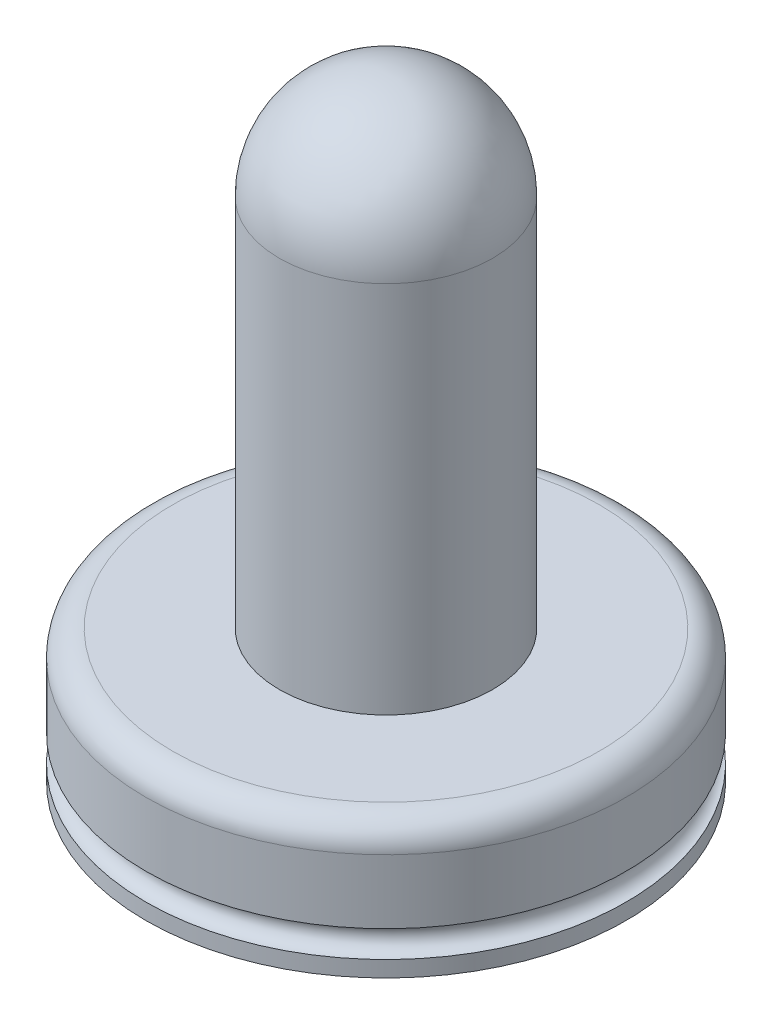
ISO-10303-21;
HEADER;
FILE_DESCRIPTION(('STEP AP214'),'2;1');
FILE_NAME('part.step','',(''),(''),'','','');
FILE_SCHEMA(('AUTOMOTIVE_DESIGN { 1 0 10303 214 1 1 1 1 }'));
ENDSEC;
DATA;
#1=APPLICATION_CONTEXT('core data for automotive mechanical design processes');
#2=APPLICATION_PROTOCOL_DEFINITION('international standard','automotive_design',2000,#1);
#3=PRODUCT_CONTEXT('',#1,'mechanical');
#4=PRODUCT('Part','Part','',(#3));
#5=PRODUCT_RELATED_PRODUCT_CATEGORY('part','',(#4));
#6=PRODUCT_DEFINITION_FORMATION('','',#4);
#7=PRODUCT_DEFINITION_CONTEXT('part definition',#1,'design');
#8=PRODUCT_DEFINITION('design','',#6,#7);
#9=PRODUCT_DEFINITION_SHAPE('','',#8);
#10=(LENGTH_UNIT() NAMED_UNIT(*) SI_UNIT(.MILLI.,.METRE.));
#11=(NAMED_UNIT(*) PLANE_ANGLE_UNIT() SI_UNIT($,.RADIAN.));
#12=(NAMED_UNIT(*) SI_UNIT($,.STERADIAN.) SOLID_ANGLE_UNIT());
#13=UNCERTAINTY_MEASURE_WITH_UNIT(LENGTH_MEASURE(1.E-05),#10,'distance_accuracy_value','');
#14=(GEOMETRIC_REPRESENTATION_CONTEXT(3) GLOBAL_UNCERTAINTY_ASSIGNED_CONTEXT((#13)) GLOBAL_UNIT_ASSIGNED_CONTEXT((#10,
#11,#12)) REPRESENTATION_CONTEXT('',''));
#15=CARTESIAN_POINT('',(0.,0.,0.));
#16=DIRECTION('',(0.,0.,1.));
#17=DIRECTION('',(1.,0.,0.));
#18=AXIS2_PLACEMENT_3D('',#15,#16,#17);
#19=CARTESIAN_POINT('',(0.,0.,0.));
#20=DIRECTION('',(0.,-1.,0.));
#21=DIRECTION('',(0.,0.,-1.));
#22=AXIS2_PLACEMENT_3D('',#19,#20,#21);
#23=CYLINDRICAL_SURFACE('',#22,8.50000000000001);
#24=CARTESIAN_POINT('',(0.,0.,0.));
#25=DIRECTION('',(0.,-1.,0.));
#26=DIRECTION('',(0.,0.,-1.));
#27=AXIS2_PLACEMENT_3D('',#24,#25,#26);
#28=CIRCLE('',#27,8.50000000000001);
#29=CARTESIAN_POINT('',(0.,0.,-8.50000000000001));
#30=VERTEX_POINT('',#29);
#31=EDGE_CURVE('E10',#30,#30,#28,.T.);
#32=ORIENTED_EDGE('',*,*,#31,.T.);
#33=EDGE_LOOP('',(#32));
#34=FACE_BOUND('',#33,.T.);
#35=CARTESIAN_POINT('',(0.,0.233974596215559,0.));
#36=DIRECTION('',(0.,-1.,0.));
#37=DIRECTION('',(0.,0.,-1.));
#38=AXIS2_PLACEMENT_3D('',#35,#36,#37);
#39=CIRCLE('',#38,8.5);
#40=CARTESIAN_POINT('',(0.,0.233974596215559,-8.5));
#41=VERTEX_POINT('',#40);
#42=EDGE_CURVE('E78',#41,#41,#39,.T.);
#43=ORIENTED_EDGE('',*,*,#42,.F.);
#44=EDGE_LOOP('',(#43));
#45=FACE_BOUND('',#44,.T.);
#46=ADVANCED_FACE('F32',(#34,#45),#23,.F.);
#47=CARTESIAN_POINT('',(9.00000000000001,0.,0.));
#48=DIRECTION('',(0.,1.,0.));
#49=DIRECTION('',(0.,0.,1.));
#50=AXIS2_PLACEMENT_3D('',#47,#48,#49);
#51=PLANE('',#50);
#52=ORIENTED_EDGE('',*,*,#31,.F.);
#53=EDGE_LOOP('',(#52));
#54=FACE_BOUND('',#53,.T.);
#55=CARTESIAN_POINT('',(0.,0.,0.));
#56=DIRECTION('',(0.,-1.,0.));
#57=DIRECTION('',(0.,0.,-1.));
#58=AXIS2_PLACEMENT_3D('',#55,#56,#57);
#59=CIRCLE('',#58,9.00000000000001);
#60=CARTESIAN_POINT('',(0.,0.,-9.00000000000001));
#61=VERTEX_POINT('',#60);
#62=EDGE_CURVE('E38',#61,#61,#59,.T.);
#63=ORIENTED_EDGE('',*,*,#62,.T.);
#64=EDGE_LOOP('',(#63));
#65=FACE_BOUND('',#64,.T.);
#66=ADVANCED_FACE('F86',(#54,#65),#51,.F.);
#67=CARTESIAN_POINT('',(0.,0.,0.));
#68=DIRECTION('',(0.,-1.,0.));
#69=DIRECTION('',(0.,0.,-1.));
#70=AXIS2_PLACEMENT_3D('',#67,#68,#69);
#71=CYLINDRICAL_SURFACE('',#70,9.00000000000001);
#72=ORIENTED_EDGE('',*,*,#62,.F.);
#73=EDGE_LOOP('',(#72));
#74=FACE_BOUND('',#73,.T.);
#75=CARTESIAN_POINT('',(0.,0.6,0.));
#76=DIRECTION('',(0.,-1.,0.));
#77=DIRECTION('',(0.,0.,-1.));
#78=AXIS2_PLACEMENT_3D('',#75,#76,#77);
#79=CIRCLE('',#78,9.);
#80=CARTESIAN_POINT('',(0.,0.6,-9.));
#81=VERTEX_POINT('',#80);
#82=EDGE_CURVE('E42',#81,#81,#79,.T.);
#83=ORIENTED_EDGE('',*,*,#82,.T.);
#84=EDGE_LOOP('',(#83));
#85=FACE_BOUND('',#84,.T.);
#86=ADVANCED_FACE('F90',(#74,#85),#71,.T.);
#87=CARTESIAN_POINT('',(0.,1.1,0.));
#88=DIRECTION('',(0.,-1.,0.));
#89=DIRECTION('',(0.,0.,-1.));
#90=AXIS2_PLACEMENT_3D('',#87,#88,#89);
#91=TOROIDAL_SURFACE('',#90,9.,0.5);
#92=ORIENTED_EDGE('',*,*,#82,.F.);
#93=EDGE_LOOP('',(#92));
#94=FACE_BOUND('',#93,.T.);
#95=CARTESIAN_POINT('',(0.,1.6,0.));
#96=DIRECTION('',(0.,-1.,0.));
#97=DIRECTION('',(0.,0.,-1.));
#98=AXIS2_PLACEMENT_3D('',#95,#96,#97);
#99=CIRCLE('',#98,9.);
#100=CARTESIAN_POINT('',(0.,1.6,-9.));
#101=VERTEX_POINT('',#100);
#102=EDGE_CURVE('E46',#101,#101,#99,.T.);
#103=ORIENTED_EDGE('',*,*,#102,.T.);
#104=EDGE_LOOP('',(#103));
#105=FACE_BOUND('',#104,.T.);
#106=ADVANCED_FACE('F95',(#94,#105),#91,.F.);
#107=CARTESIAN_POINT('',(0.,0.,0.));
#108=DIRECTION('',(0.,-1.,0.));
#109=DIRECTION('',(0.,0.,-1.));
#110=AXIS2_PLACEMENT_3D('',#107,#108,#109);
#111=CYLINDRICAL_SURFACE('',#110,9.);
#112=ORIENTED_EDGE('',*,*,#102,.F.);
#113=EDGE_LOOP('',(#112));
#114=FACE_BOUND('',#113,.T.);
#115=CARTESIAN_POINT('',(0.,4.,0.));
#116=DIRECTION('',(0.,-1.,0.));
#117=DIRECTION('',(0.,0.,-1.));
#118=AXIS2_PLACEMENT_3D('',#115,#116,#117);
#119=CIRCLE('',#118,9.);
#120=CARTESIAN_POINT('',(0.,4.,-9.));
#121=VERTEX_POINT('',#120);
#122=EDGE_CURVE('E51',#121,#121,#119,.T.);
#123=ORIENTED_EDGE('',*,*,#122,.T.);
#124=EDGE_LOOP('',(#123));
#125=FACE_BOUND('',#124,.T.);
#126=ADVANCED_FACE('F101',(#114,#125),#111,.T.);
#127=CARTESIAN_POINT('',(0.,4.,0.));
#128=DIRECTION('',(0.,-1.,0.));
#129=DIRECTION('',(0.,0.,-1.));
#130=AXIS2_PLACEMENT_3D('',#127,#128,#129);
#131=TOROIDAL_SURFACE('',#130,8.,1.);
#132=ORIENTED_EDGE('',*,*,#122,.F.);
#133=EDGE_LOOP('',(#132));
#134=FACE_BOUND('',#133,.T.);
#135=CARTESIAN_POINT('',(0.,5.,0.));
#136=DIRECTION('',(0.,-1.,0.));
#137=DIRECTION('',(0.,0.,-1.));
#138=AXIS2_PLACEMENT_3D('',#135,#136,#137);
#139=CIRCLE('',#138,8.);
#140=CARTESIAN_POINT('',(0.,5.,-8.));
#141=VERTEX_POINT('',#140);
#142=EDGE_CURVE('E54',#141,#141,#139,.T.);
#143=ORIENTED_EDGE('',*,*,#142,.T.);
#144=EDGE_LOOP('',(#143));
#145=FACE_BOUND('',#144,.T.);
#146=ADVANCED_FACE('F105',(#134,#145),#131,.T.);
#147=CARTESIAN_POINT('',(4.00000000000001,5.,0.));
#148=DIRECTION('',(0.,-1.,0.));
#149=DIRECTION('',(0.,0.,-1.));
#150=AXIS2_PLACEMENT_3D('',#147,#148,#149);
#151=PLANE('',#150);
#152=ORIENTED_EDGE('',*,*,#142,.F.);
#153=EDGE_LOOP('',(#152));
#154=FACE_BOUND('',#153,.T.);
#155=CARTESIAN_POINT('',(0.,5.,0.));
#156=DIRECTION('',(0.,-1.,0.));
#157=DIRECTION('',(0.,0.,-1.));
#158=AXIS2_PLACEMENT_3D('',#155,#156,#157);
#159=CIRCLE('',#158,4.00000000000001);
#160=CARTESIAN_POINT('',(0.,5.,-4.00000000000001));
#161=VERTEX_POINT('',#160);
#162=EDGE_CURVE('E57',#161,#161,#159,.T.);
#163=ORIENTED_EDGE('',*,*,#162,.T.);
#164=EDGE_LOOP('',(#163));
#165=FACE_BOUND('',#164,.T.);
#166=ADVANCED_FACE('F109',(#154,#165),#151,.F.);
#167=CARTESIAN_POINT('',(0.,0.,0.));
#168=DIRECTION('',(0.,-1.,0.));
#169=DIRECTION('',(0.,0.,-1.));
#170=AXIS2_PLACEMENT_3D('',#167,#168,#169);
#171=CYLINDRICAL_SURFACE('',#170,4.);
#172=ORIENTED_EDGE('',*,*,#162,.F.);
#173=EDGE_LOOP('',(#172));
#174=FACE_BOUND('',#173,.T.);
#175=CARTESIAN_POINT('',(0.,19.,0.));
#176=DIRECTION('',(0.,-1.,0.));
#177=DIRECTION('',(0.,0.,-1.));
#178=AXIS2_PLACEMENT_3D('',#175,#176,#177);
#179=CIRCLE('',#178,4.);
#180=CARTESIAN_POINT('',(0.,19.,-4.));
#181=VERTEX_POINT('',#180);
#182=EDGE_CURVE('E60',#181,#181,#179,.T.);
#183=ORIENTED_EDGE('',*,*,#182,.T.);
#184=EDGE_LOOP('',(#183));
#185=FACE_BOUND('',#184,.T.);
#186=ADVANCED_FACE('F113',(#174,#185),#171,.T.);
#187=CARTESIAN_POINT('',(0.,19.,0.));
#188=DIRECTION('',(0.,-1.,0.));
#189=DIRECTION('',(1.,0.,0.));
#190=AXIS2_PLACEMENT_3D('',#187,#188,#189);
#191=SPHERICAL_SURFACE('',#190,4.);
#192=ORIENTED_EDGE('',*,*,#182,.F.);
#193=EDGE_LOOP('',(#192));
#194=FACE_BOUND('',#193,.T.);
#195=ADVANCED_FACE('F117',(#194),#191,.T.);
#196=CARTESIAN_POINT('',(0.,19.,0.));
#197=DIRECTION('',(0.,-1.,0.));
#198=DIRECTION('',(1.,0.,0.));
#199=AXIS2_PLACEMENT_3D('',#196,#197,#198);
#200=SPHERICAL_SURFACE('',#199,3.5);
#201=CARTESIAN_POINT('',(0.,19.,0.));
#202=DIRECTION('',(0.,-1.,0.));
#203=DIRECTION('',(0.,0.,-1.));
#204=AXIS2_PLACEMENT_3D('',#201,#202,#203);
#205=CIRCLE('',#204,3.5);
#206=CARTESIAN_POINT('',(0.,19.,-3.5));
#207=VERTEX_POINT('',#206);
#208=EDGE_CURVE('E63',#207,#207,#205,.T.);
#209=ORIENTED_EDGE('',*,*,#208,.T.);
#210=EDGE_LOOP('',(#209));
#211=FACE_BOUND('',#210,.T.);
#212=ADVANCED_FACE('F121',(#211),#200,.F.);
#213=CARTESIAN_POINT('',(0.,0.,0.));
#214=DIRECTION('',(0.,-1.,0.));
#215=DIRECTION('',(0.,0.,-1.));
#216=AXIS2_PLACEMENT_3D('',#213,#214,#215);
#217=CYLINDRICAL_SURFACE('',#216,3.5);
#218=CARTESIAN_POINT('',(0.,4.5,0.));
#219=DIRECTION('',(0.,-1.,0.));
#220=DIRECTION('',(0.,0.,-1.));
#221=AXIS2_PLACEMENT_3D('',#218,#219,#220);
#222=CIRCLE('',#221,3.50000000000001);
#223=CARTESIAN_POINT('',(0.,4.5,-3.50000000000001));
#224=VERTEX_POINT('',#223);
#225=EDGE_CURVE('E66',#224,#224,#222,.T.);
#226=ORIENTED_EDGE('',*,*,#225,.T.);
#227=EDGE_LOOP('',(#226));
#228=FACE_BOUND('',#227,.T.);
#229=ORIENTED_EDGE('',*,*,#208,.F.);
#230=EDGE_LOOP('',(#229));
#231=FACE_BOUND('',#230,.T.);
#232=ADVANCED_FACE('F125',(#228,#231),#217,.F.);
#233=CARTESIAN_POINT('',(4.00000000000001,4.5,0.));
#234=DIRECTION('',(0.,-1.,0.));
#235=DIRECTION('',(0.,0.,-1.));
#236=AXIS2_PLACEMENT_3D('',#233,#234,#235);
#237=PLANE('',#236);
#238=CARTESIAN_POINT('',(0.,4.5,0.));
#239=DIRECTION('',(0.,-1.,0.));
#240=DIRECTION('',(0.,0.,-1.));
#241=AXIS2_PLACEMENT_3D('',#238,#239,#240);
#242=CIRCLE('',#241,8.);
#243=CARTESIAN_POINT('',(0.,4.5,-8.));
#244=VERTEX_POINT('',#243);
#245=EDGE_CURVE('E69',#244,#244,#242,.T.);
#246=ORIENTED_EDGE('',*,*,#245,.T.);
#247=EDGE_LOOP('',(#246));
#248=FACE_BOUND('',#247,.T.);
#249=ORIENTED_EDGE('',*,*,#225,.F.);
#250=EDGE_LOOP('',(#249));
#251=FACE_BOUND('',#250,.T.);
#252=ADVANCED_FACE('F129',(#248,#251),#237,.T.);
#253=CARTESIAN_POINT('',(0.,4.,0.));
#254=DIRECTION('',(0.,-1.,0.));
#255=DIRECTION('',(0.,0.,-1.));
#256=AXIS2_PLACEMENT_3D('',#253,#254,#255);
#257=TOROIDAL_SURFACE('',#256,8.,0.5);
#258=CARTESIAN_POINT('',(0.,4.,0.));
#259=DIRECTION('',(0.,-1.,0.));
#260=DIRECTION('',(0.,0.,-1.));
#261=AXIS2_PLACEMENT_3D('',#258,#259,#260);
#262=CIRCLE('',#261,8.5);
#263=CARTESIAN_POINT('',(0.,4.,-8.5));
#264=VERTEX_POINT('',#263);
#265=EDGE_CURVE('E72',#264,#264,#262,.T.);
#266=ORIENTED_EDGE('',*,*,#265,.T.);
#267=EDGE_LOOP('',(#266));
#268=FACE_BOUND('',#267,.T.);
#269=ORIENTED_EDGE('',*,*,#245,.F.);
#270=EDGE_LOOP('',(#269));
#271=FACE_BOUND('',#270,.T.);
#272=ADVANCED_FACE('F133',(#268,#271),#257,.F.);
#273=CARTESIAN_POINT('',(0.,0.,0.));
#274=DIRECTION('',(0.,-1.,0.));
#275=DIRECTION('',(0.,0.,-1.));
#276=AXIS2_PLACEMENT_3D('',#273,#274,#275);
#277=CYLINDRICAL_SURFACE('',#276,8.5);
#278=CARTESIAN_POINT('',(0.,1.96602540378444,0.));
#279=DIRECTION('',(0.,-1.,0.));
#280=DIRECTION('',(0.,0.,-1.));
#281=AXIS2_PLACEMENT_3D('',#278,#279,#280);
#282=CIRCLE('',#281,8.5);
#283=CARTESIAN_POINT('',(0.,1.96602540378444,-8.5));
#284=VERTEX_POINT('',#283);
#285=EDGE_CURVE('E75',#284,#284,#282,.T.);
#286=ORIENTED_EDGE('',*,*,#285,.T.);
#287=EDGE_LOOP('',(#286));
#288=FACE_BOUND('',#287,.T.);
#289=ORIENTED_EDGE('',*,*,#265,.F.);
#290=EDGE_LOOP('',(#289));
#291=FACE_BOUND('',#290,.T.);
#292=ADVANCED_FACE('F137',(#288,#291),#277,.F.);
#293=CARTESIAN_POINT('',(0.,1.1,0.));
#294=DIRECTION('',(0.,-1.,0.));
#295=DIRECTION('',(0.,0.,-1.));
#296=AXIS2_PLACEMENT_3D('',#293,#294,#295);
#297=TOROIDAL_SURFACE('',#296,9.,1.);
#298=ORIENTED_EDGE('',*,*,#42,.T.);
#299=EDGE_LOOP('',(#298));
#300=FACE_BOUND('',#299,.T.);
#301=ORIENTED_EDGE('',*,*,#285,.F.);
#302=EDGE_LOOP('',(#301));
#303=FACE_BOUND('',#302,.T.);
#304=ADVANCED_FACE('F82',(#300,#303),#297,.T.);
#305=CLOSED_SHELL('',(#46,#66,#86,#106,#126,#146,#166,#186,#195,#212,#232,#252,#272,#292,#304));
#306=MANIFOLD_SOLID_BREP('B2',#305);
#307=ADVANCED_BREP_SHAPE_REPRESENTATION('',(#18,#306),#14);
#308=SHAPE_DEFINITION_REPRESENTATION(#9,#307);
ENDSEC;
END-ISO-10303-21;
